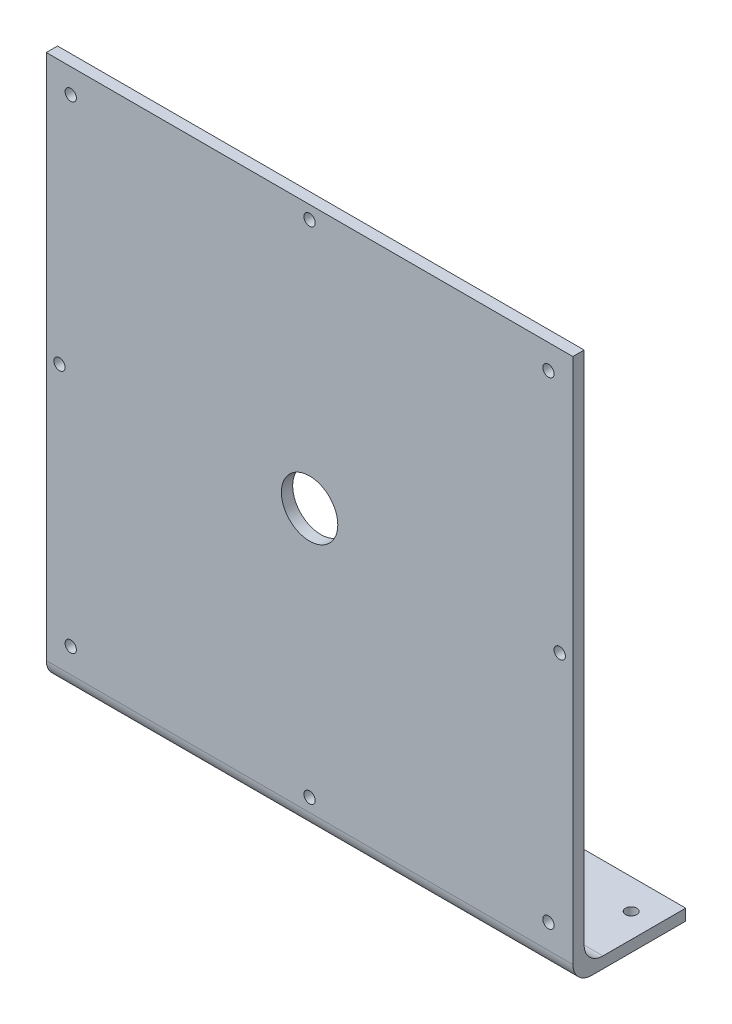
ISO-10303-21;
HEADER;
FILE_DESCRIPTION(('STEP AP214'),'2;1');
FILE_NAME('part.step','',(''),(''),'','','');
FILE_SCHEMA(('AUTOMOTIVE_DESIGN { 1 0 10303 214 1 1 1 1 }'));
ENDSEC;
DATA;
#1=APPLICATION_CONTEXT('core data for automotive mechanical design processes');
#2=APPLICATION_PROTOCOL_DEFINITION('international standard','automotive_design',2000,#1);
#3=PRODUCT_CONTEXT('',#1,'mechanical');
#4=PRODUCT('Part','Part','',(#3));
#5=PRODUCT_RELATED_PRODUCT_CATEGORY('part','',(#4));
#6=PRODUCT_DEFINITION_FORMATION('','',#4);
#7=PRODUCT_DEFINITION_CONTEXT('part definition',#1,'design');
#8=PRODUCT_DEFINITION('design','',#6,#7);
#9=PRODUCT_DEFINITION_SHAPE('','',#8);
#10=(LENGTH_UNIT() NAMED_UNIT(*) SI_UNIT(.MILLI.,.METRE.));
#11=(NAMED_UNIT(*) PLANE_ANGLE_UNIT() SI_UNIT($,.RADIAN.));
#12=(NAMED_UNIT(*) SI_UNIT($,.STERADIAN.) SOLID_ANGLE_UNIT());
#13=UNCERTAINTY_MEASURE_WITH_UNIT(LENGTH_MEASURE(1.E-05),#10,'distance_accuracy_value','');
#14=(GEOMETRIC_REPRESENTATION_CONTEXT(3) GLOBAL_UNCERTAINTY_ASSIGNED_CONTEXT((#13)) GLOBAL_UNIT_ASSIGNED_CONTEXT((#10,
#11,#12)) REPRESENTATION_CONTEXT('',''));
#15=CARTESIAN_POINT('',(0.,0.,0.));
#16=DIRECTION('',(0.,0.,1.));
#17=DIRECTION('',(1.,0.,0.));
#18=AXIS2_PLACEMENT_3D('',#15,#16,#17);
#19=CARTESIAN_POINT('',(0.,0.,0.));
#20=DIRECTION('',(0.,0.,-1.));
#21=DIRECTION('',(-1.,0.,0.));
#22=AXIS2_PLACEMENT_3D('',#19,#20,#21);
#23=PLANE('',#22);
#24=CARTESIAN_POINT('',(0.,69.,0.));
#25=DIRECTION('',(0.,0.,-1.));
#26=DIRECTION('',(-1.,0.,0.));
#27=AXIS2_PLACEMENT_3D('',#24,#25,#26);
#28=CIRCLE('',#27,1.5);
#29=CARTESIAN_POINT('',(-1.5,69.,0.));
#30=VERTEX_POINT('',#29);
#31=EDGE_CURVE('E244',#30,#30,#28,.T.);
#32=ORIENTED_EDGE('',*,*,#31,.F.);
#33=EDGE_LOOP('',(#32));
#34=FACE_BOUND('',#33,.T.);
#35=CARTESIAN_POINT('',(0.,2.49999999999995,0.));
#36=DIRECTION('',(0.,0.,-1.));
#37=DIRECTION('',(-1.,0.,0.));
#38=AXIS2_PLACEMENT_3D('',#35,#36,#37);
#39=CIRCLE('',#38,7.5);
#40=CARTESIAN_POINT('',(-7.5,2.49999999999995,0.));
#41=VERTEX_POINT('',#40);
#42=EDGE_CURVE('E125',#41,#41,#39,.T.);
#43=ORIENTED_EDGE('',*,*,#42,.F.);
#44=EDGE_LOOP('',(#43));
#45=FACE_BOUND('',#44,.T.);
#46=CARTESIAN_POINT('',(0.,-64.0000000000001,0.));
#47=DIRECTION('',(0.,0.,-1.));
#48=DIRECTION('',(-1.,0.,0.));
#49=AXIS2_PLACEMENT_3D('',#46,#47,#48);
#50=CIRCLE('',#49,1.5);
#51=CARTESIAN_POINT('',(-1.41421356237315,-64.5,0.));
#52=VERTEX_POINT('',#51);
#53=CARTESIAN_POINT('',(1.41421356237315,-64.5,0.));
#54=VERTEX_POINT('',#53);
#55=EDGE_CURVE('E57',#52,#54,#50,.T.);
#56=ORIENTED_EDGE('',*,*,#55,.F.);
#57=DIRECTION('',(-1.,0.,0.));
#58=VECTOR('',#57,1.);
#59=CARTESIAN_POINT('',(0.,-64.5,0.));
#60=LINE('',#59,#58);
#61=CARTESIAN_POINT('',(-70.,-64.5,0.));
#62=VERTEX_POINT('',#61);
#63=EDGE_CURVE('E118',#52,#62,#60,.T.);
#64=ORIENTED_EDGE('',*,*,#63,.T.);
#65=DIRECTION('',(0.,-1.,0.));
#66=VECTOR('',#65,1.);
#67=CARTESIAN_POINT('',(-70.,-72.5,0.));
#68=LINE('',#67,#66);
#69=CARTESIAN_POINT('',(-70.,72.5,0.));
#70=VERTEX_POINT('',#69);
#71=EDGE_CURVE('E149',#70,#62,#68,.T.);
#72=ORIENTED_EDGE('',*,*,#71,.F.);
#73=DIRECTION('',(-1.,0.,0.));
#74=VECTOR('',#73,1.);
#75=CARTESIAN_POINT('',(-70.,72.5,0.));
#76=LINE('',#75,#74);
#77=CARTESIAN_POINT('',(70.,72.5,0.));
#78=VERTEX_POINT('',#77);
#79=EDGE_CURVE('E144',#78,#70,#76,.T.);
#80=ORIENTED_EDGE('',*,*,#79,.F.);
#81=DIRECTION('',(0.,1.,0.));
#82=VECTOR('',#81,1.);
#83=CARTESIAN_POINT('',(70.,-72.5,0.));
#84=LINE('',#83,#82);
#85=CARTESIAN_POINT('',(70.,-64.5,0.));
#86=VERTEX_POINT('',#85);
#87=EDGE_CURVE('E140',#86,#78,#84,.T.);
#88=ORIENTED_EDGE('',*,*,#87,.F.);
#89=EDGE_CURVE('E122',#86,#54,#60,.T.);
#90=ORIENTED_EDGE('',*,*,#89,.T.);
#91=EDGE_LOOP('',(#56,#64,#72,#80,#88,#90));
#92=FACE_BOUND('',#91,.T.);
#93=CARTESIAN_POINT('',(-63.5,-61.0000000000001,0.));
#94=DIRECTION('',(0.,0.,1.));
#95=DIRECTION('',(-1.,0.,0.));
#96=AXIS2_PLACEMENT_3D('',#93,#94,#95);
#97=CIRCLE('',#96,1.5);
#98=CARTESIAN_POINT('',(-65.,-61.0000000000001,0.));
#99=VERTEX_POINT('',#98);
#100=EDGE_CURVE('E220',#99,#99,#97,.T.);
#101=ORIENTED_EDGE('',*,*,#100,.T.);
#102=EDGE_LOOP('',(#101));
#103=FACE_BOUND('',#102,.T.);
#104=CARTESIAN_POINT('',(63.5,65.9999999999999,0.));
#105=DIRECTION('',(0.,0.,1.));
#106=DIRECTION('',(-1.,0.,0.));
#107=AXIS2_PLACEMENT_3D('',#104,#105,#106);
#108=CIRCLE('',#107,1.5);
#109=CARTESIAN_POINT('',(62.,65.9999999999999,0.));
#110=VERTEX_POINT('',#109);
#111=EDGE_CURVE('E205',#110,#110,#108,.T.);
#112=ORIENTED_EDGE('',*,*,#111,.T.);
#113=EDGE_LOOP('',(#112));
#114=FACE_BOUND('',#113,.T.);
#115=CARTESIAN_POINT('',(-63.5,65.9999999999999,0.));
#116=DIRECTION('',(0.,0.,1.));
#117=DIRECTION('',(1.,0.,0.));
#118=AXIS2_PLACEMENT_3D('',#115,#116,#117);
#119=CIRCLE('',#118,1.5);
#120=CARTESIAN_POINT('',(-62.,65.9999999999999,0.));
#121=VERTEX_POINT('',#120);
#122=EDGE_CURVE('E152',#121,#121,#119,.T.);
#123=ORIENTED_EDGE('',*,*,#122,.T.);
#124=EDGE_LOOP('',(#123));
#125=FACE_BOUND('',#124,.T.);
#126=CARTESIAN_POINT('',(-66.5,2.49999999999995,0.));
#127=DIRECTION('',(0.,0.,1.));
#128=DIRECTION('',(1.,0.,0.));
#129=AXIS2_PLACEMENT_3D('',#126,#127,#128);
#130=CIRCLE('',#129,1.5);
#131=CARTESIAN_POINT('',(-65.,2.49999999999995,0.));
#132=VERTEX_POINT('',#131);
#133=EDGE_CURVE('E196',#132,#132,#130,.T.);
#134=ORIENTED_EDGE('',*,*,#133,.T.);
#135=EDGE_LOOP('',(#134));
#136=FACE_BOUND('',#135,.T.);
#137=CARTESIAN_POINT('',(63.5,-61.0000000000001,0.));
#138=DIRECTION('',(0.,0.,1.));
#139=DIRECTION('',(1.,0.,0.));
#140=AXIS2_PLACEMENT_3D('',#137,#138,#139);
#141=CIRCLE('',#140,1.5);
#142=CARTESIAN_POINT('',(65.,-61.0000000000001,0.));
#143=VERTEX_POINT('',#142);
#144=EDGE_CURVE('E212',#143,#143,#141,.T.);
#145=ORIENTED_EDGE('',*,*,#144,.T.);
#146=EDGE_LOOP('',(#145));
#147=FACE_BOUND('',#146,.T.);
#148=CARTESIAN_POINT('',(66.5,2.49999999999995,0.));
#149=DIRECTION('',(0.,0.,1.));
#150=DIRECTION('',(-1.,0.,0.));
#151=AXIS2_PLACEMENT_3D('',#148,#149,#150);
#152=CIRCLE('',#151,1.5);
#153=CARTESIAN_POINT('',(65.,2.49999999999995,0.));
#154=VERTEX_POINT('',#153);
#155=EDGE_CURVE('E224',#154,#154,#152,.T.);
#156=ORIENTED_EDGE('',*,*,#155,.T.);
#157=EDGE_LOOP('',(#156));
#158=FACE_BOUND('',#157,.T.);
#159=ADVANCED_FACE('F40',(#34,#45,#92,#103,#114,#125,#136,#147,#158),#23,.T.);
#160=CARTESIAN_POINT('',(0.,0.,3.));
#161=DIRECTION('',(0.,0.,-1.));
#162=DIRECTION('',(-1.,0.,0.));
#163=AXIS2_PLACEMENT_3D('',#160,#161,#162);
#164=PLANE('',#163);
#165=CARTESIAN_POINT('',(0.,69.,3.));
#166=DIRECTION('',(0.,0.,1.));
#167=DIRECTION('',(1.,0.,0.));
#168=AXIS2_PLACEMENT_3D('',#165,#166,#167);
#169=CIRCLE('',#168,1.5);
#170=CARTESIAN_POINT('',(1.5,69.,3.));
#171=VERTEX_POINT('',#170);
#172=EDGE_CURVE('E124',#171,#171,#169,.T.);
#173=ORIENTED_EDGE('',*,*,#172,.F.);
#174=EDGE_LOOP('',(#173));
#175=FACE_BOUND('',#174,.T.);
#176=CARTESIAN_POINT('',(0.,2.49999999999995,3.));
#177=DIRECTION('',(0.,0.,1.));
#178=DIRECTION('',(1.,0.,0.));
#179=AXIS2_PLACEMENT_3D('',#176,#177,#178);
#180=CIRCLE('',#179,7.5);
#181=CARTESIAN_POINT('',(7.5,2.49999999999995,3.));
#182=VERTEX_POINT('',#181);
#183=EDGE_CURVE('E258',#182,#182,#180,.T.);
#184=ORIENTED_EDGE('',*,*,#183,.F.);
#185=EDGE_LOOP('',(#184));
#186=FACE_BOUND('',#185,.T.);
#187=CARTESIAN_POINT('',(0.,-64.0000000000001,3.));
#188=DIRECTION('',(0.,0.,1.));
#189=DIRECTION('',(-1.,0.,0.));
#190=AXIS2_PLACEMENT_3D('',#187,#188,#189);
#191=CIRCLE('',#190,1.5);
#192=CARTESIAN_POINT('',(-1.5,-64.0000000000001,3.));
#193=VERTEX_POINT('',#192);
#194=EDGE_CURVE('E260',#193,#193,#191,.T.);
#195=ORIENTED_EDGE('',*,*,#194,.F.);
#196=EDGE_LOOP('',(#195));
#197=FACE_BOUND('',#196,.T.);
#198=DIRECTION('',(0.,-1.,0.));
#199=VECTOR('',#198,1.);
#200=CARTESIAN_POINT('',(-70.,-72.5,3.));
#201=LINE('',#200,#199);
#202=CARTESIAN_POINT('',(-70.,72.5,3.));
#203=VERTEX_POINT('',#202);
#204=CARTESIAN_POINT('',(-70.,-67.5,3.));
#205=VERTEX_POINT('',#204);
#206=EDGE_CURVE('E151',#203,#205,#201,.T.);
#207=ORIENTED_EDGE('',*,*,#206,.T.);
#208=DIRECTION('',(1.,0.,0.));
#209=VECTOR('',#208,1.);
#210=CARTESIAN_POINT('',(0.,-67.5,3.));
#211=LINE('',#210,#209);
#212=CARTESIAN_POINT('',(70.,-67.5,3.));
#213=VERTEX_POINT('',#212);
#214=EDGE_CURVE('E166',#205,#213,#211,.T.);
#215=ORIENTED_EDGE('',*,*,#214,.T.);
#216=DIRECTION('',(0.,1.,0.));
#217=VECTOR('',#216,1.);
#218=CARTESIAN_POINT('',(70.,-72.5,3.));
#219=LINE('',#218,#217);
#220=CARTESIAN_POINT('',(70.,72.5,3.));
#221=VERTEX_POINT('',#220);
#222=EDGE_CURVE('E159',#213,#221,#219,.T.);
#223=ORIENTED_EDGE('',*,*,#222,.T.);
#224=DIRECTION('',(-1.,0.,0.));
#225=VECTOR('',#224,1.);
#226=CARTESIAN_POINT('',(-70.,72.5,3.));
#227=LINE('',#226,#225);
#228=EDGE_CURVE('E194',#221,#203,#227,.T.);
#229=ORIENTED_EDGE('',*,*,#228,.T.);
#230=EDGE_LOOP('',(#207,#215,#223,#229));
#231=FACE_BOUND('',#230,.T.);
#232=CARTESIAN_POINT('',(66.5,2.49999999999995,3.));
#233=DIRECTION('',(0.,0.,1.));
#234=DIRECTION('',(-1.,0.,0.));
#235=AXIS2_PLACEMENT_3D('',#232,#233,#234);
#236=CIRCLE('',#235,1.5);
#237=CARTESIAN_POINT('',(65.,2.49999999999995,3.));
#238=VERTEX_POINT('',#237);
#239=EDGE_CURVE('E218',#238,#238,#236,.T.);
#240=ORIENTED_EDGE('',*,*,#239,.F.);
#241=EDGE_LOOP('',(#240));
#242=FACE_BOUND('',#241,.T.);
#243=CARTESIAN_POINT('',(-63.5,-61.0000000000001,3.));
#244=DIRECTION('',(0.,0.,1.));
#245=DIRECTION('',(-1.,0.,0.));
#246=AXIS2_PLACEMENT_3D('',#243,#244,#245);
#247=CIRCLE('',#246,1.5);
#248=CARTESIAN_POINT('',(-65.,-61.0000000000001,3.));
#249=VERTEX_POINT('',#248);
#250=EDGE_CURVE('E211',#249,#249,#247,.T.);
#251=ORIENTED_EDGE('',*,*,#250,.F.);
#252=EDGE_LOOP('',(#251));
#253=FACE_BOUND('',#252,.T.);
#254=CARTESIAN_POINT('',(63.5,-61.0000000000001,3.));
#255=DIRECTION('',(0.,0.,1.));
#256=DIRECTION('',(1.,0.,0.));
#257=AXIS2_PLACEMENT_3D('',#254,#255,#256);
#258=CIRCLE('',#257,1.5);
#259=CARTESIAN_POINT('',(65.,-61.0000000000001,3.));
#260=VERTEX_POINT('',#259);
#261=EDGE_CURVE('E206',#260,#260,#258,.T.);
#262=ORIENTED_EDGE('',*,*,#261,.F.);
#263=EDGE_LOOP('',(#262));
#264=FACE_BOUND('',#263,.T.);
#265=CARTESIAN_POINT('',(63.5,65.9999999999999,3.));
#266=DIRECTION('',(0.,0.,1.));
#267=DIRECTION('',(-1.,0.,0.));
#268=AXIS2_PLACEMENT_3D('',#265,#266,#267);
#269=CIRCLE('',#268,1.5);
#270=CARTESIAN_POINT('',(62.,65.9999999999999,3.));
#271=VERTEX_POINT('',#270);
#272=EDGE_CURVE('E202',#271,#271,#269,.T.);
#273=ORIENTED_EDGE('',*,*,#272,.F.);
#274=EDGE_LOOP('',(#273));
#275=FACE_BOUND('',#274,.T.);
#276=CARTESIAN_POINT('',(-66.5,2.49999999999995,3.));
#277=DIRECTION('',(0.,0.,1.));
#278=DIRECTION('',(1.,0.,0.));
#279=AXIS2_PLACEMENT_3D('',#276,#277,#278);
#280=CIRCLE('',#279,1.5);
#281=CARTESIAN_POINT('',(-65.,2.49999999999995,3.));
#282=VERTEX_POINT('',#281);
#283=EDGE_CURVE('E200',#282,#282,#280,.T.);
#284=ORIENTED_EDGE('',*,*,#283,.F.);
#285=EDGE_LOOP('',(#284));
#286=FACE_BOUND('',#285,.T.);
#287=CARTESIAN_POINT('',(-63.5,65.9999999999999,3.));
#288=DIRECTION('',(0.,0.,1.));
#289=DIRECTION('',(1.,0.,0.));
#290=AXIS2_PLACEMENT_3D('',#287,#288,#289);
#291=CIRCLE('',#290,1.5);
#292=CARTESIAN_POINT('',(-62.,65.9999999999999,3.));
#293=VERTEX_POINT('',#292);
#294=EDGE_CURVE('E147',#293,#293,#291,.T.);
#295=ORIENTED_EDGE('',*,*,#294,.F.);
#296=EDGE_LOOP('',(#295));
#297=FACE_BOUND('',#296,.T.);
#298=ADVANCED_FACE('F188',(#175,#186,#197,#231,#242,#253,#264,#275,#286,#297),#164,.F.);
#299=CARTESIAN_POINT('',(70.,-72.5,3.));
#300=DIRECTION('',(-1.,0.,0.));
#301=DIRECTION('',(0.,-1.,0.));
#302=AXIS2_PLACEMENT_3D('',#299,#300,#301);
#303=PLANE('',#302);
#304=ORIENTED_EDGE('',*,*,#222,.F.);
#305=CARTESIAN_POINT('',(70.,-67.5,-2.));
#306=DIRECTION('',(-1.,0.,0.));
#307=DIRECTION('',(0.,-1.,0.));
#308=AXIS2_PLACEMENT_3D('',#305,#306,#307);
#309=CIRCLE('',#308,5.);
#310=CARTESIAN_POINT('',(70.,-72.5,-2.));
#311=VERTEX_POINT('',#310);
#312=EDGE_CURVE('E171',#213,#311,#309,.F.);
#313=ORIENTED_EDGE('',*,*,#312,.T.);
#314=DIRECTION('',(0.,0.,-1.));
#315=VECTOR('',#314,1.);
#316=CARTESIAN_POINT('',(70.,-72.5,3.));
#317=LINE('',#316,#315);
#318=CARTESIAN_POINT('',(70.,-72.5,-27.));
#319=VERTEX_POINT('',#318);
#320=EDGE_CURVE('E158',#311,#319,#317,.T.);
#321=ORIENTED_EDGE('',*,*,#320,.T.);
#322=DIRECTION('',(0.,-1.,0.));
#323=VECTOR('',#322,1.);
#324=CARTESIAN_POINT('',(70.,-69.5,-27.));
#325=LINE('',#324,#323);
#326=CARTESIAN_POINT('',(70.,-69.5,-27.));
#327=VERTEX_POINT('',#326);
#328=EDGE_CURVE('E228',#327,#319,#325,.T.);
#329=ORIENTED_EDGE('',*,*,#328,.F.);
#330=DIRECTION('',(0.,0.,1.));
#331=VECTOR('',#330,1.);
#332=CARTESIAN_POINT('',(70.,-69.5,3.));
#333=LINE('',#332,#331);
#334=CARTESIAN_POINT('',(70.,-69.5,-5.));
#335=VERTEX_POINT('',#334);
#336=EDGE_CURVE('E141',#327,#335,#333,.T.);
#337=ORIENTED_EDGE('',*,*,#336,.T.);
#338=CARTESIAN_POINT('',(70.,-64.5,-5.));
#339=DIRECTION('',(-1.,0.,0.));
#340=DIRECTION('',(0.,-1.,0.));
#341=AXIS2_PLACEMENT_3D('',#338,#339,#340);
#342=CIRCLE('',#341,5.);
#343=EDGE_CURVE('E49',#335,#86,#342,.T.);
#344=ORIENTED_EDGE('',*,*,#343,.T.);
#345=ORIENTED_EDGE('',*,*,#87,.T.);
#346=DIRECTION('',(0.,0.,-1.));
#347=VECTOR('',#346,1.);
#348=CARTESIAN_POINT('',(70.,72.5,3.));
#349=LINE('',#348,#347);
#350=EDGE_CURVE('E168',#221,#78,#349,.T.);
#351=ORIENTED_EDGE('',*,*,#350,.F.);
#352=EDGE_LOOP('',(#304,#313,#321,#329,#337,#344,#345,#351));
#353=FACE_BOUND('',#352,.T.);
#354=ADVANCED_FACE('F139',(#353),#303,.F.);
#355=CARTESIAN_POINT('',(-70.,72.5,3.));
#356=DIRECTION('',(0.,-1.,0.));
#357=DIRECTION('',(1.,0.,0.));
#358=AXIS2_PLACEMENT_3D('',#355,#356,#357);
#359=PLANE('',#358);
#360=ORIENTED_EDGE('',*,*,#79,.T.);
#361=DIRECTION('',(0.,0.,-1.));
#362=VECTOR('',#361,1.);
#363=CARTESIAN_POINT('',(-70.,72.5,3.));
#364=LINE('',#363,#362);
#365=EDGE_CURVE('E161',#203,#70,#364,.T.);
#366=ORIENTED_EDGE('',*,*,#365,.F.);
#367=ORIENTED_EDGE('',*,*,#228,.F.);
#368=ORIENTED_EDGE('',*,*,#350,.T.);
#369=EDGE_LOOP('',(#360,#366,#367,#368));
#370=FACE_BOUND('',#369,.T.);
#371=ADVANCED_FACE('F297',(#370),#359,.F.);
#372=CARTESIAN_POINT('',(-70.,-72.5,3.));
#373=DIRECTION('',(1.,0.,0.));
#374=DIRECTION('',(0.,1.,0.));
#375=AXIS2_PLACEMENT_3D('',#372,#373,#374);
#376=PLANE('',#375);
#377=DIRECTION('',(0.,0.,-1.));
#378=VECTOR('',#377,1.);
#379=CARTESIAN_POINT('',(-70.,-72.5,3.));
#380=LINE('',#379,#378);
#381=CARTESIAN_POINT('',(-70.,-72.5,-2.));
#382=VERTEX_POINT('',#381);
#383=CARTESIAN_POINT('',(-70.,-72.5,-27.));
#384=VERTEX_POINT('',#383);
#385=EDGE_CURVE('E163',#382,#384,#380,.T.);
#386=ORIENTED_EDGE('',*,*,#385,.F.);
#387=CARTESIAN_POINT('',(-70.,-67.5,-2.));
#388=DIRECTION('',(1.,0.,0.));
#389=DIRECTION('',(0.,1.,0.));
#390=AXIS2_PLACEMENT_3D('',#387,#388,#389);
#391=CIRCLE('',#390,5.);
#392=EDGE_CURVE('E127',#382,#205,#391,.F.);
#393=ORIENTED_EDGE('',*,*,#392,.T.);
#394=ORIENTED_EDGE('',*,*,#206,.F.);
#395=ORIENTED_EDGE('',*,*,#365,.T.);
#396=ORIENTED_EDGE('',*,*,#71,.T.);
#397=CARTESIAN_POINT('',(-70.,-64.5,-5.));
#398=DIRECTION('',(1.,0.,0.));
#399=DIRECTION('',(0.,1.,0.));
#400=AXIS2_PLACEMENT_3D('',#397,#398,#399);
#401=CIRCLE('',#400,5.);
#402=CARTESIAN_POINT('',(-70.,-69.5,-5.));
#403=VERTEX_POINT('',#402);
#404=EDGE_CURVE('E64',#62,#403,#401,.T.);
#405=ORIENTED_EDGE('',*,*,#404,.T.);
#406=DIRECTION('',(0.,0.,-1.));
#407=VECTOR('',#406,1.);
#408=CARTESIAN_POINT('',(-70.,-69.5,3.));
#409=LINE('',#408,#407);
#410=CARTESIAN_POINT('',(-70.,-69.5,-27.));
#411=VERTEX_POINT('',#410);
#412=EDGE_CURVE('E234',#403,#411,#409,.T.);
#413=ORIENTED_EDGE('',*,*,#412,.T.);
#414=DIRECTION('',(0.,-1.,0.));
#415=VECTOR('',#414,1.);
#416=CARTESIAN_POINT('',(-70.,-69.5,-27.));
#417=LINE('',#416,#415);
#418=EDGE_CURVE('E184',#411,#384,#417,.T.);
#419=ORIENTED_EDGE('',*,*,#418,.T.);
#420=EDGE_LOOP('',(#386,#393,#394,#395,#396,#405,#413,#419));
#421=FACE_BOUND('',#420,.T.);
#422=ADVANCED_FACE('F181',(#421),#376,.F.);
#423=CARTESIAN_POINT('',(-70.,-72.5,3.));
#424=DIRECTION('',(0.,1.,0.));
#425=DIRECTION('',(0.,0.,1.));
#426=AXIS2_PLACEMENT_3D('',#423,#424,#425);
#427=PLANE('',#426);
#428=CARTESIAN_POINT('',(-63.5,-72.5,-19.));
#429=DIRECTION('',(0.,1.,0.));
#430=DIRECTION('',(0.,0.,1.));
#431=AXIS2_PLACEMENT_3D('',#428,#429,#430);
#432=CIRCLE('',#431,1.5);
#433=CARTESIAN_POINT('',(-63.5,-72.5,-17.5));
#434=VERTEX_POINT('',#433);
#435=EDGE_CURVE('E232',#434,#434,#432,.T.);
#436=ORIENTED_EDGE('',*,*,#435,.T.);
#437=EDGE_LOOP('',(#436));
#438=FACE_BOUND('',#437,.T.);
#439=CARTESIAN_POINT('',(63.5,-72.5,-19.));
#440=DIRECTION('',(0.,1.,0.));
#441=DIRECTION('',(0.,0.,-1.));
#442=AXIS2_PLACEMENT_3D('',#439,#440,#441);
#443=CIRCLE('',#442,1.5);
#444=CARTESIAN_POINT('',(63.5,-72.5,-20.5));
#445=VERTEX_POINT('',#444);
#446=EDGE_CURVE('E242',#445,#445,#443,.T.);
#447=ORIENTED_EDGE('',*,*,#446,.T.);
#448=EDGE_LOOP('',(#447));
#449=FACE_BOUND('',#448,.T.);
#450=ORIENTED_EDGE('',*,*,#320,.F.);
#451=DIRECTION('',(1.,0.,0.));
#452=VECTOR('',#451,1.);
#453=CARTESIAN_POINT('',(-70.,-72.5,-2.));
#454=LINE('',#453,#452);
#455=EDGE_CURVE('E126',#311,#382,#454,.F.);
#456=ORIENTED_EDGE('',*,*,#455,.T.);
#457=ORIENTED_EDGE('',*,*,#385,.T.);
#458=DIRECTION('',(1.,0.,0.));
#459=VECTOR('',#458,1.);
#460=CARTESIAN_POINT('',(-70.,-72.5,-27.));
#461=LINE('',#460,#459);
#462=EDGE_CURVE('E235',#384,#319,#461,.T.);
#463=ORIENTED_EDGE('',*,*,#462,.T.);
#464=EDGE_LOOP('',(#450,#456,#457,#463));
#465=FACE_BOUND('',#464,.T.);
#466=ADVANCED_FACE('F176',(#438,#449,#465),#427,.F.);
#467=CARTESIAN_POINT('',(-63.5,65.9999999999999,3.));
#468=DIRECTION('',(0.,0.,-1.));
#469=DIRECTION('',(-1.,0.,0.));
#470=AXIS2_PLACEMENT_3D('',#467,#468,#469);
#471=CYLINDRICAL_SURFACE('',#470,1.5);
#472=ORIENTED_EDGE('',*,*,#294,.T.);
#473=EDGE_LOOP('',(#472));
#474=FACE_BOUND('',#473,.T.);
#475=ORIENTED_EDGE('',*,*,#122,.F.);
#476=EDGE_LOOP('',(#475));
#477=FACE_BOUND('',#476,.T.);
#478=ADVANCED_FACE('F298',(#474,#477),#471,.F.);
#479=CARTESIAN_POINT('',(-66.5,2.49999999999995,3.));
#480=DIRECTION('',(0.,0.,-1.));
#481=DIRECTION('',(-1.,0.,0.));
#482=AXIS2_PLACEMENT_3D('',#479,#480,#481);
#483=CYLINDRICAL_SURFACE('',#482,1.5);
#484=ORIENTED_EDGE('',*,*,#283,.T.);
#485=EDGE_LOOP('',(#484));
#486=FACE_BOUND('',#485,.T.);
#487=ORIENTED_EDGE('',*,*,#133,.F.);
#488=EDGE_LOOP('',(#487));
#489=FACE_BOUND('',#488,.T.);
#490=ADVANCED_FACE('F345',(#486,#489),#483,.F.);
#491=CARTESIAN_POINT('',(63.5,65.9999999999999,3.));
#492=DIRECTION('',(0.,0.,-1.));
#493=DIRECTION('',(-1.,0.,0.));
#494=AXIS2_PLACEMENT_3D('',#491,#492,#493);
#495=CYLINDRICAL_SURFACE('',#494,1.5);
#496=ORIENTED_EDGE('',*,*,#272,.T.);
#497=EDGE_LOOP('',(#496));
#498=FACE_BOUND('',#497,.T.);
#499=ORIENTED_EDGE('',*,*,#111,.F.);
#500=EDGE_LOOP('',(#499));
#501=FACE_BOUND('',#500,.T.);
#502=ADVANCED_FACE('F336',(#498,#501),#495,.F.);
#503=CARTESIAN_POINT('',(63.5,-61.0000000000001,3.));
#504=DIRECTION('',(0.,0.,-1.));
#505=DIRECTION('',(-1.,0.,0.));
#506=AXIS2_PLACEMENT_3D('',#503,#504,#505);
#507=CYLINDRICAL_SURFACE('',#506,1.5);
#508=ORIENTED_EDGE('',*,*,#261,.T.);
#509=EDGE_LOOP('',(#508));
#510=FACE_BOUND('',#509,.T.);
#511=ORIENTED_EDGE('',*,*,#144,.F.);
#512=EDGE_LOOP('',(#511));
#513=FACE_BOUND('',#512,.T.);
#514=ADVANCED_FACE('F333',(#510,#513),#507,.F.);
#515=CARTESIAN_POINT('',(-63.5,-61.0000000000001,3.));
#516=DIRECTION('',(0.,0.,-1.));
#517=DIRECTION('',(-1.,0.,0.));
#518=AXIS2_PLACEMENT_3D('',#515,#516,#517);
#519=CYLINDRICAL_SURFACE('',#518,1.5);
#520=ORIENTED_EDGE('',*,*,#250,.T.);
#521=EDGE_LOOP('',(#520));
#522=FACE_BOUND('',#521,.T.);
#523=ORIENTED_EDGE('',*,*,#100,.F.);
#524=EDGE_LOOP('',(#523));
#525=FACE_BOUND('',#524,.T.);
#526=ADVANCED_FACE('F328',(#522,#525),#519,.F.);
#527=CARTESIAN_POINT('',(66.5,2.49999999999995,3.));
#528=DIRECTION('',(0.,0.,-1.));
#529=DIRECTION('',(-1.,0.,0.));
#530=AXIS2_PLACEMENT_3D('',#527,#528,#529);
#531=CYLINDRICAL_SURFACE('',#530,1.5);
#532=ORIENTED_EDGE('',*,*,#239,.T.);
#533=EDGE_LOOP('',(#532));
#534=FACE_BOUND('',#533,.T.);
#535=ORIENTED_EDGE('',*,*,#155,.F.);
#536=EDGE_LOOP('',(#535));
#537=FACE_BOUND('',#536,.T.);
#538=ADVANCED_FACE('F327',(#534,#537),#531,.F.);
#539=CARTESIAN_POINT('',(-70.,-69.5,-27.));
#540=DIRECTION('',(0.,0.,-1.));
#541=DIRECTION('',(-1.,0.,0.));
#542=AXIS2_PLACEMENT_3D('',#539,#540,#541);
#543=PLANE('',#542);
#544=ORIENTED_EDGE('',*,*,#462,.F.);
#545=ORIENTED_EDGE('',*,*,#418,.F.);
#546=DIRECTION('',(1.,0.,0.));
#547=VECTOR('',#546,1.);
#548=CARTESIAN_POINT('',(-70.,-69.5,-27.));
#549=LINE('',#548,#547);
#550=EDGE_CURVE('E240',#411,#327,#549,.T.);
#551=ORIENTED_EDGE('',*,*,#550,.T.);
#552=ORIENTED_EDGE('',*,*,#328,.T.);
#553=EDGE_LOOP('',(#544,#545,#551,#552));
#554=FACE_BOUND('',#553,.T.);
#555=ADVANCED_FACE('F325',(#554),#543,.T.);
#556=CARTESIAN_POINT('',(0.,-69.5,0.));
#557=DIRECTION('',(0.,-1.,0.));
#558=DIRECTION('',(0.,0.,-1.));
#559=AXIS2_PLACEMENT_3D('',#556,#557,#558);
#560=PLANE('',#559);
#561=CARTESIAN_POINT('',(-63.5,-69.5,-19.));
#562=DIRECTION('',(0.,1.,0.));
#563=DIRECTION('',(0.,0.,1.));
#564=AXIS2_PLACEMENT_3D('',#561,#562,#563);
#565=CIRCLE('',#564,1.5);
#566=CARTESIAN_POINT('',(-63.5,-69.5,-17.5));
#567=VERTEX_POINT('',#566);
#568=EDGE_CURVE('E247',#567,#567,#565,.T.);
#569=ORIENTED_EDGE('',*,*,#568,.F.);
#570=EDGE_LOOP('',(#569));
#571=FACE_BOUND('',#570,.T.);
#572=CARTESIAN_POINT('',(63.5,-69.5,-19.));
#573=DIRECTION('',(0.,1.,0.));
#574=DIRECTION('',(0.,0.,-1.));
#575=AXIS2_PLACEMENT_3D('',#572,#573,#574);
#576=CIRCLE('',#575,1.5);
#577=CARTESIAN_POINT('',(63.5,-69.5,-20.5));
#578=VERTEX_POINT('',#577);
#579=EDGE_CURVE('E241',#578,#578,#576,.T.);
#580=ORIENTED_EDGE('',*,*,#579,.F.);
#581=EDGE_LOOP('',(#580));
#582=FACE_BOUND('',#581,.T.);
#583=ORIENTED_EDGE('',*,*,#412,.F.);
#584=DIRECTION('',(-1.,0.,0.));
#585=VECTOR('',#584,1.);
#586=CARTESIAN_POINT('',(0.,-69.5,-5.));
#587=LINE('',#586,#585);
#588=EDGE_CURVE('E129',#403,#335,#587,.F.);
#589=ORIENTED_EDGE('',*,*,#588,.T.);
#590=ORIENTED_EDGE('',*,*,#336,.F.);
#591=ORIENTED_EDGE('',*,*,#550,.F.);
#592=EDGE_LOOP('',(#583,#589,#590,#591));
#593=FACE_BOUND('',#592,.T.);
#594=ADVANCED_FACE('F314',(#571,#582,#593),#560,.F.);
#595=CARTESIAN_POINT('',(63.5,-72.5,-19.));
#596=DIRECTION('',(0.,1.,0.));
#597=DIRECTION('',(0.,0.,1.));
#598=AXIS2_PLACEMENT_3D('',#595,#596,#597);
#599=CYLINDRICAL_SURFACE('',#598,1.5);
#600=ORIENTED_EDGE('',*,*,#446,.F.);
#601=EDGE_LOOP('',(#600));
#602=FACE_BOUND('',#601,.T.);
#603=ORIENTED_EDGE('',*,*,#579,.T.);
#604=EDGE_LOOP('',(#603));
#605=FACE_BOUND('',#604,.T.);
#606=ADVANCED_FACE('F309',(#602,#605),#599,.F.);
#607=CARTESIAN_POINT('',(-63.5,-72.5,-19.));
#608=DIRECTION('',(0.,1.,0.));
#609=DIRECTION('',(0.,0.,1.));
#610=AXIS2_PLACEMENT_3D('',#607,#608,#609);
#611=CYLINDRICAL_SURFACE('',#610,1.5);
#612=ORIENTED_EDGE('',*,*,#435,.F.);
#613=EDGE_LOOP('',(#612));
#614=FACE_BOUND('',#613,.T.);
#615=ORIENTED_EDGE('',*,*,#568,.T.);
#616=EDGE_LOOP('',(#615));
#617=FACE_BOUND('',#616,.T.);
#618=ADVANCED_FACE('F304',(#614,#617),#611,.F.);
#619=CARTESIAN_POINT('',(0.,-67.5,-2.));
#620=DIRECTION('',(1.,0.,0.));
#621=DIRECTION('',(0.,0.,-1.));
#622=AXIS2_PLACEMENT_3D('',#619,#620,#621);
#623=CYLINDRICAL_SURFACE('',#622,5.);
#624=ORIENTED_EDGE('',*,*,#392,.F.);
#625=ORIENTED_EDGE('',*,*,#455,.F.);
#626=ORIENTED_EDGE('',*,*,#312,.F.);
#627=ORIENTED_EDGE('',*,*,#214,.F.);
#628=EDGE_LOOP('',(#624,#625,#626,#627));
#629=FACE_BOUND('',#628,.T.);
#630=ADVANCED_FACE('F189',(#629),#623,.T.);
#631=CARTESIAN_POINT('',(0.,-64.5,-5.));
#632=DIRECTION('',(-1.,0.,0.));
#633=DIRECTION('',(0.,0.,1.));
#634=AXIS2_PLACEMENT_3D('',#631,#632,#633);
#635=CYLINDRICAL_SURFACE('',#634,5.);
#636=ORIENTED_EDGE('',*,*,#63,.F.);
#637=CARTESIAN_POINT('',(1.41421356237315,-64.5,0.));
#638=CARTESIAN_POINT('',(1.44140058975745,-64.4231014200796,-7.5235487308221E-07));
#639=CARTESIAN_POINT('',(1.46230015871111,-64.3439717115456,-0.00178982117574143));
#640=CARTESIAN_POINT('',(1.49095551144617,-64.1835516971881,-0.00937812139665488));
#641=CARTESIAN_POINT('',(1.49871076064105,-64.1022613036248,-0.0151775158852904));
#642=CARTESIAN_POINT('',(1.50099226644445,-63.9399494919887,-0.0307961709948069));
#643=CARTESIAN_POINT('',(1.49552798631987,-63.8589279230579,-0.0406125518556556));
#644=CARTESIAN_POINT('',(1.47177122221435,-63.6993307407805,-0.0638641208421074));
#645=CARTESIAN_POINT('',(1.45347710360242,-63.6207554404417,-0.0772997699590369));
#646=CARTESIAN_POINT('',(1.40438461583114,-63.4667599140175,-0.107283566393943));
#647=CARTESIAN_POINT('',(1.37338262292649,-63.3914142452848,-0.123879924042754));
#648=CARTESIAN_POINT('',(1.2998581201698,-63.2470484133015,-0.158963012815341));
#649=CARTESIAN_POINT('',(1.25733238947105,-63.1780300257337,-0.177450271539038));
#650=CARTESIAN_POINT('',(1.15938307280281,-63.0444707410481,-0.2160149566066));
#651=CARTESIAN_POINT('',(1.10340864182047,-62.9803426654805,-0.236125265978494));
#652=CARTESIAN_POINT('',(0.98125013509865,-62.8622983507712,-0.275403611009185));
#653=CARTESIAN_POINT('',(0.915063451932085,-62.8083847274726,-0.294571404368759));
#654=CARTESIAN_POINT('',(0.772857371605128,-62.711509417079,-0.33052250972635));
#655=CARTESIAN_POINT('',(0.696697543677507,-62.6687368468837,-0.347262743195398));
#656=CARTESIAN_POINT('',(0.537389119461291,-62.5968472887431,-0.376200287051584));
#657=CARTESIAN_POINT('',(0.454244456831457,-62.5677226746552,-0.38840013370913));
#658=CARTESIAN_POINT('',(0.288588161375646,-62.5256939162588,-0.406242324395498));
#659=CARTESIAN_POINT('',(0.206333271137076,-62.5119276867144,-0.412231679626062));
#660=CARTESIAN_POINT('',(0.040477334167882,-62.4982421288978,-0.418185173117261));
#661=CARTESIAN_POINT('',(-0.0431231038974081,-62.4983167064415,-0.418151963146799));
#662=CARTESIAN_POINT('',(-0.203552745232463,-62.5118373240637,-0.412271678286585));
#663=CARTESIAN_POINT('',(-0.280470822101561,-62.5244203534967,-0.406799840655811));
#664=CARTESIAN_POINT('',(-0.430984839071159,-62.5611618928738,-0.391171379474964));
#665=CARTESIAN_POINT('',(-0.504580370430381,-62.5853218227914,-0.381014181244218));
#666=CARTESIAN_POINT('',(-0.648019376320493,-62.6449279928849,-0.356751549127299));
#667=CARTESIAN_POINT('',(-0.717764314594385,-62.6805810250421,-0.342574396594454));
#668=CARTESIAN_POINT('',(-0.850468965651077,-62.7619506209047,-0.311601995618842));
#669=CARTESIAN_POINT('',(-0.913426385281418,-62.8076705699294,-0.29480586701831));
#670=CARTESIAN_POINT('',(-1.03577648825955,-62.9118378516866,-0.258586805178256));
#671=CARTESIAN_POINT('',(-1.09454483800247,-62.9709838426718,-0.239061317171037));
#672=CARTESIAN_POINT('',(-1.20152280004826,-63.0981942071398,-0.200066196758969));
#673=CARTESIAN_POINT('',(-1.2497292573413,-63.1662612358046,-0.180596582753975));
#674=CARTESIAN_POINT('',(-1.33606920944825,-63.3126676734651,-0.142409629791925));
#675=CARTESIAN_POINT('',(-1.37371763117477,-63.3913108004954,-0.123754367851596));
#676=CARTESIAN_POINT('',(-1.43496903513989,-63.5545169113618,-0.0895007077049054));
#677=CARTESIAN_POINT('',(-1.45857529682191,-63.6390785078228,-0.0739015963281777));
#678=CARTESIAN_POINT('',(-1.49020715261309,-63.8089342886571,-0.0472653012767503));
#679=CARTESIAN_POINT('',(-1.49870290233742,-63.894120287806,-0.0360991874576921));
#680=CARTESIAN_POINT('',(-1.50102059944281,-64.0651499108249,-0.0182041810690282));
#681=CARTESIAN_POINT('',(-1.49484719916977,-64.1509933175897,-0.0114738825378326));
#682=CARTESIAN_POINT('',(-1.4685067423293,-64.3165000146993,-0.00271357006033338));
#683=CARTESIAN_POINT('',(-1.44902530471744,-64.3962622097816,-0.000473532465455375));
#684=CARTESIAN_POINT('',(-1.39731328134723,-64.5515545728825,0.00033737720716623));
#685=CARTESIAN_POINT('',(-1.36508292404486,-64.6270848167084,-0.00109168496868375));
#686=CARTESIAN_POINT('',(-1.28899790663864,-64.7714340717936,-0.00685233335211284));
#687=CARTESIAN_POINT('',(-1.24520070857591,-64.8402840190957,-0.011169729052485));
#688=CARTESIAN_POINT('',(-1.14712668530227,-64.9699009552114,-0.0217042904435298));
#689=CARTESIAN_POINT('',(-1.09284818942112,-65.0306666528218,-0.0279217590891821));
#690=CARTESIAN_POINT('',(-0.973569071605892,-65.1441724048268,-0.0413302286660935));
#691=CARTESIAN_POINT('',(-0.908308712942235,-65.1966370089548,-0.0485437824969826));
#692=CARTESIAN_POINT('',(-0.769947723935887,-65.290018442091,-0.0625808732696888));
#693=CARTESIAN_POINT('',(-0.696846466590925,-65.330934346649,-0.069404378954086));
#694=CARTESIAN_POINT('',(-0.543730755061111,-65.4005431547544,-0.0816369921790191));
#695=CARTESIAN_POINT('',(-0.463637182203918,-65.4290659759539,-0.0870260477856588));
#696=CARTESIAN_POINT('',(-0.299669845929402,-65.4722031224562,-0.0953787357811704));
#697=CARTESIAN_POINT('',(-0.215796613533688,-65.4868193952122,-0.0983427077671511));
#698=CARTESIAN_POINT('',(-0.048107372452811,-65.501550824083,-0.101331590303418));
#699=CARTESIAN_POINT('',(0.0356875090448646,-65.501897286486,-0.101403381202156));
#700=CARTESIAN_POINT('',(0.202119627625814,-65.4886624881668,-0.0987154046828624));
#701=CARTESIAN_POINT('',(0.28475690527942,-65.4750817167939,-0.0959557367513923));
#702=CARTESIAN_POINT('',(0.445822219470906,-65.4346011899335,-0.0880821950802591));
#703=CARTESIAN_POINT('',(0.524280140478467,-65.4078159967724,-0.0829885969984013));
#704=CARTESIAN_POINT('',(0.675635877797106,-65.3417660714092,-0.0712527938797588));
#705=CARTESIAN_POINT('',(0.748532765366144,-65.3024992602991,-0.0646103309169385));
#706=CARTESIAN_POINT('',(0.888033238906172,-65.2117906375694,-0.0507082634536174));
#707=CARTESIAN_POINT('',(0.954508847953923,-65.1601532934777,-0.0434400906278203));
#708=CARTESIAN_POINT('',(1.07794034991407,-65.0464618199185,-0.0296228200532573));
#709=CARTESIAN_POINT('',(1.13489760677029,-64.9844091854814,-0.023073619324736));
#710=CARTESIAN_POINT('',(1.23500750882743,-64.8550388471446,-0.0122216819786014));
#711=CARTESIAN_POINT('',(1.27872773053176,-64.7881683252808,-0.00781909252470721));
#712=CARTESIAN_POINT('',(1.35503863176854,-64.6482420443006,-0.00170814625258225));
#713=CARTESIAN_POINT('',(1.38763147924081,-64.5751874934802,7.35614066907522E-07));
#714=CARTESIAN_POINT('',(1.41421356237315,-64.5,0.));
#715=B_SPLINE_CURVE_WITH_KNOTS('',3,(#637,#638,#639,#640,#641,#642,#643,#644,#645,#646,#647,
#648,#649,#650,#651,#652,#653,#654,#655,#656,#657,#658,#659,#660,#661,#662,#663,#664,#665,#666,
#667,#668,#669,#670,#671,#672,#673,#674,#675,#676,#677,#678,#679,#680,#681,#682,#683,#684,#685,
#686,#687,#688,#689,#690,#691,#692,#693,#694,#695,#696,#697,#698,#699,#700,#701,#702,#703,#704,
#705,#706,#707,#708,#709,#710,#711,#712,#713,#714),.UNSPECIFIED.,.T.,.F.,(4,2,2,2,2,2,2,2,2,2,2,
2,2,2,2,2,2,2,2,2,2,2,2,2,2,2,2,2,2,2,2,2,2,2,2,2,2,2,4),(0.,0.244406314670341,
0.488822569238077,0.733063908972969,0.977336372795066,1.22568623165708,1.47410557520791,
1.73530085698413,1.99656293872571,2.26200694554986,2.52730245139531,2.77681130009125,
3.02621028892238,3.25951855022526,3.492855435454,3.73064989365933,3.96852444023938,
4.22429150902688,4.48013487576459,4.74630414301326,5.01241122395277,5.2700832744285,
5.5276736146826,5.77290491764682,6.01813182635485,6.26216268715885,6.50623247750549,
6.75720215956019,7.00819192554246,7.26252511230995,7.51682267737603,7.76699655936154,
8.01716165150106,8.26519351399762,8.51326670974496,8.7655549888868,9.01780708501644,
9.25682165716592,9.49578963563595),.UNSPECIFIED.);
#716=EDGE_CURVE('E11',#52,#54,#715,.T.);
#717=ORIENTED_EDGE('',*,*,#716,.T.);
#718=ORIENTED_EDGE('',*,*,#89,.F.);
#719=ORIENTED_EDGE('',*,*,#343,.F.);
#720=ORIENTED_EDGE('',*,*,#588,.F.);
#721=ORIENTED_EDGE('',*,*,#404,.F.);
#722=EDGE_LOOP('',(#636,#717,#718,#719,#720,#721));
#723=FACE_BOUND('',#722,.T.);
#724=ADVANCED_FACE('F39',(#723),#635,.F.);
#725=CARTESIAN_POINT('',(0.,-64.0000000000001,-27.));
#726=DIRECTION('',(0.,0.,1.));
#727=DIRECTION('',(1.,0.,0.));
#728=AXIS2_PLACEMENT_3D('',#725,#726,#727);
#729=CYLINDRICAL_SURFACE('',#728,1.5);
#730=ORIENTED_EDGE('',*,*,#55,.T.);
#731=ORIENTED_EDGE('',*,*,#716,.F.);
#732=EDGE_LOOP('',(#730,#731));
#733=FACE_BOUND('',#732,.T.);
#734=ORIENTED_EDGE('',*,*,#194,.T.);
#735=EDGE_LOOP('',(#734));
#736=FACE_BOUND('',#735,.T.);
#737=ADVANCED_FACE('F109',(#733,#736),#729,.F.);
#738=CARTESIAN_POINT('',(0.,2.49999999999995,-27.));
#739=DIRECTION('',(0.,0.,1.));
#740=DIRECTION('',(1.,0.,0.));
#741=AXIS2_PLACEMENT_3D('',#738,#739,#740);
#742=CYLINDRICAL_SURFACE('',#741,7.5);
#743=ORIENTED_EDGE('',*,*,#42,.T.);
#744=EDGE_LOOP('',(#743));
#745=FACE_BOUND('',#744,.T.);
#746=ORIENTED_EDGE('',*,*,#183,.T.);
#747=EDGE_LOOP('',(#746));
#748=FACE_BOUND('',#747,.T.);
#749=ADVANCED_FACE('F273',(#745,#748),#742,.F.);
#750=CARTESIAN_POINT('',(0.,69.,-27.));
#751=DIRECTION('',(0.,0.,1.));
#752=DIRECTION('',(1.,0.,0.));
#753=AXIS2_PLACEMENT_3D('',#750,#751,#752);
#754=CYLINDRICAL_SURFACE('',#753,1.5);
#755=ORIENTED_EDGE('',*,*,#31,.T.);
#756=EDGE_LOOP('',(#755));
#757=FACE_BOUND('',#756,.T.);
#758=ORIENTED_EDGE('',*,*,#172,.T.);
#759=EDGE_LOOP('',(#758));
#760=FACE_BOUND('',#759,.T.);
#761=ADVANCED_FACE('F266',(#757,#760),#754,.F.);
#762=CLOSED_SHELL('',(#159,#298,#354,#371,#422,#466,#478,#490,#502,#514,#526,#538,#555,#594,
#606,#618,#630,#724,#737,#749,#761));
#763=MANIFOLD_SOLID_BREP('B2',#762);
#764=ADVANCED_BREP_SHAPE_REPRESENTATION('',(#18,#763),#14);
#765=SHAPE_DEFINITION_REPRESENTATION(#9,#764);
ENDSEC;
END-ISO-10303-21;
